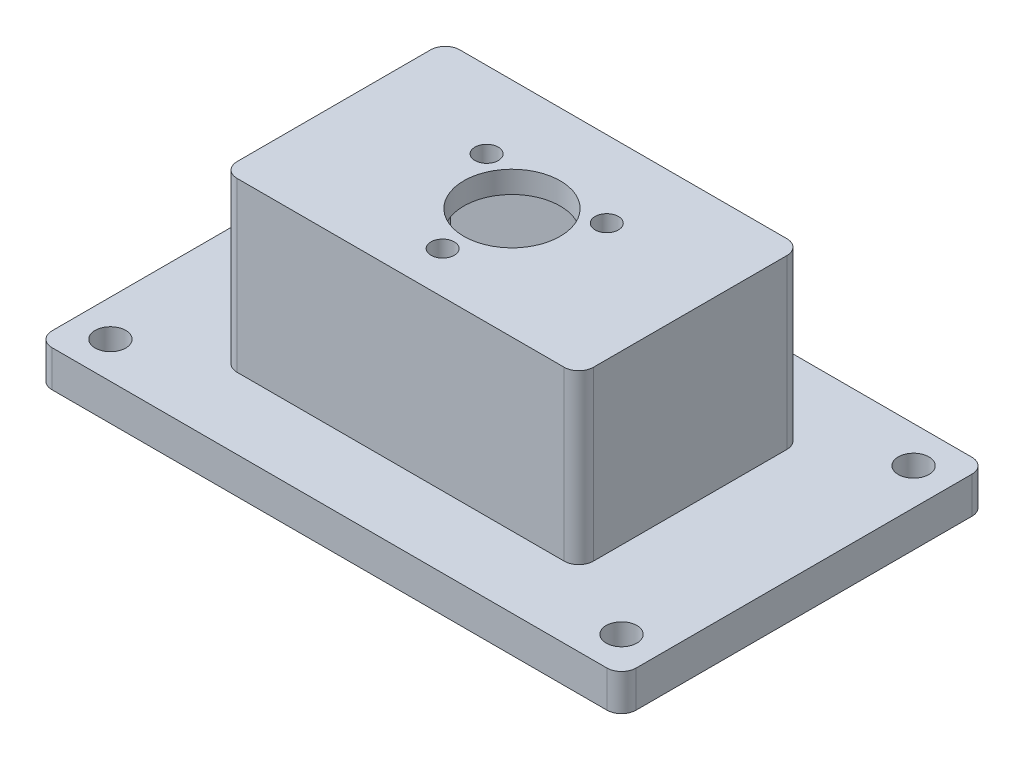
ISO-10303-21;
HEADER;
FILE_DESCRIPTION(('STEP AP214'),'2;1');
FILE_NAME('part.step','',(''),(''),'','','');
FILE_SCHEMA(('AUTOMOTIVE_DESIGN { 1 0 10303 214 1 1 1 1 }'));
ENDSEC;
DATA;
#1=APPLICATION_CONTEXT('core data for automotive mechanical design processes');
#2=APPLICATION_PROTOCOL_DEFINITION('international standard','automotive_design',2000,#1);
#3=PRODUCT_CONTEXT('',#1,'mechanical');
#4=PRODUCT('Part','Part','',(#3));
#5=PRODUCT_RELATED_PRODUCT_CATEGORY('part','',(#4));
#6=PRODUCT_DEFINITION_FORMATION('','',#4);
#7=PRODUCT_DEFINITION_CONTEXT('part definition',#1,'design');
#8=PRODUCT_DEFINITION('design','',#6,#7);
#9=PRODUCT_DEFINITION_SHAPE('','',#8);
#10=(LENGTH_UNIT() NAMED_UNIT(*) SI_UNIT(.MILLI.,.METRE.));
#11=(NAMED_UNIT(*) PLANE_ANGLE_UNIT() SI_UNIT($,.RADIAN.));
#12=(NAMED_UNIT(*) SI_UNIT($,.STERADIAN.) SOLID_ANGLE_UNIT());
#13=UNCERTAINTY_MEASURE_WITH_UNIT(LENGTH_MEASURE(1.E-05),#10,'distance_accuracy_value','');
#14=(GEOMETRIC_REPRESENTATION_CONTEXT(3) GLOBAL_UNCERTAINTY_ASSIGNED_CONTEXT((#13)) GLOBAL_UNIT_ASSIGNED_CONTEXT((#10,
#11,#12)) REPRESENTATION_CONTEXT('',''));
#15=CARTESIAN_POINT('',(0.,0.,0.));
#16=DIRECTION('',(0.,0.,1.));
#17=DIRECTION('',(1.,0.,0.));
#18=AXIS2_PLACEMENT_3D('',#15,#16,#17);
#19=CARTESIAN_POINT('',(0.,5.,0.));
#20=DIRECTION('',(0.,-1.,0.));
#21=DIRECTION('',(0.,0.,-1.));
#22=AXIS2_PLACEMENT_3D('',#19,#20,#21);
#23=PLANE('',#22);
#24=CARTESIAN_POINT('',(-35.,5.,-20.));
#25=DIRECTION('',(0.,1.,0.));
#26=DIRECTION('',(0.,0.,-1.));
#27=AXIS2_PLACEMENT_3D('',#24,#25,#26);
#28=CIRCLE('',#27,2.1);
#29=CARTESIAN_POINT('',(-35.,5.,-22.1));
#30=VERTEX_POINT('',#29);
#31=EDGE_CURVE('E224',#30,#30,#28,.T.);
#32=ORIENTED_EDGE('',*,*,#31,.F.);
#33=EDGE_LOOP('',(#32));
#34=FACE_BOUND('',#33,.T.);
#35=CARTESIAN_POINT('',(-35.,5.,20.));
#36=DIRECTION('',(0.,1.,0.));
#37=DIRECTION('',(0.,0.,1.));
#38=AXIS2_PLACEMENT_3D('',#35,#36,#37);
#39=CIRCLE('',#38,2.1);
#40=CARTESIAN_POINT('',(-35.,5.,22.1));
#41=VERTEX_POINT('',#40);
#42=EDGE_CURVE('E230',#41,#41,#39,.T.);
#43=ORIENTED_EDGE('',*,*,#42,.F.);
#44=EDGE_LOOP('',(#43));
#45=FACE_BOUND('',#44,.T.);
#46=CARTESIAN_POINT('',(35.,5.,20.));
#47=DIRECTION('',(0.,1.,0.));
#48=DIRECTION('',(0.,0.,-1.));
#49=AXIS2_PLACEMENT_3D('',#46,#47,#48);
#50=CIRCLE('',#49,2.1);
#51=CARTESIAN_POINT('',(35.,5.,17.9));
#52=VERTEX_POINT('',#51);
#53=EDGE_CURVE('E236',#52,#52,#50,.T.);
#54=ORIENTED_EDGE('',*,*,#53,.F.);
#55=EDGE_LOOP('',(#54));
#56=FACE_BOUND('',#55,.T.);
#57=DIRECTION('',(-1.,0.,0.));
#58=VECTOR('',#57,1.);
#59=CARTESIAN_POINT('',(-40.,5.,-25.));
#60=LINE('',#59,#58);
#61=CARTESIAN_POINT('',(38.,5.,-25.));
#62=VERTEX_POINT('',#61);
#63=CARTESIAN_POINT('',(-38.,5.,-25.));
#64=VERTEX_POINT('',#63);
#65=EDGE_CURVE('E264',#62,#64,#60,.T.);
#66=ORIENTED_EDGE('',*,*,#65,.T.);
#67=CARTESIAN_POINT('',(-38.,5.,-23.));
#68=DIRECTION('',(0.,-1.,0.));
#69=DIRECTION('',(0.,0.,-1.));
#70=AXIS2_PLACEMENT_3D('',#67,#68,#69);
#71=CIRCLE('',#70,2.);
#72=CARTESIAN_POINT('',(-40.,5.,-23.));
#73=VERTEX_POINT('',#72);
#74=EDGE_CURVE('E308',#64,#73,#71,.F.);
#75=ORIENTED_EDGE('',*,*,#74,.T.);
#76=DIRECTION('',(0.,0.,1.));
#77=VECTOR('',#76,1.);
#78=CARTESIAN_POINT('',(-40.,5.,25.));
#79=LINE('',#78,#77);
#80=CARTESIAN_POINT('',(-40.,5.,23.));
#81=VERTEX_POINT('',#80);
#82=EDGE_CURVE('E268',#73,#81,#79,.T.);
#83=ORIENTED_EDGE('',*,*,#82,.T.);
#84=CARTESIAN_POINT('',(-38.,5.,23.));
#85=DIRECTION('',(0.,-1.,0.));
#86=DIRECTION('',(0.,0.,-1.));
#87=AXIS2_PLACEMENT_3D('',#84,#85,#86);
#88=CIRCLE('',#87,2.);
#89=CARTESIAN_POINT('',(-38.,5.,25.));
#90=VERTEX_POINT('',#89);
#91=EDGE_CURVE('E306',#81,#90,#88,.F.);
#92=ORIENTED_EDGE('',*,*,#91,.T.);
#93=DIRECTION('',(1.,0.,0.));
#94=VECTOR('',#93,1.);
#95=CARTESIAN_POINT('',(-40.,5.,25.));
#96=LINE('',#95,#94);
#97=CARTESIAN_POINT('',(38.,5.,25.));
#98=VERTEX_POINT('',#97);
#99=EDGE_CURVE('E271',#90,#98,#96,.T.);
#100=ORIENTED_EDGE('',*,*,#99,.T.);
#101=CARTESIAN_POINT('',(38.,5.,23.));
#102=DIRECTION('',(0.,-1.,0.));
#103=DIRECTION('',(0.,0.,-1.));
#104=AXIS2_PLACEMENT_3D('',#101,#102,#103);
#105=CIRCLE('',#104,2.);
#106=CARTESIAN_POINT('',(40.,5.,23.));
#107=VERTEX_POINT('',#106);
#108=EDGE_CURVE('E304',#98,#107,#105,.F.);
#109=ORIENTED_EDGE('',*,*,#108,.T.);
#110=DIRECTION('',(0.,0.,-1.));
#111=VECTOR('',#110,1.);
#112=CARTESIAN_POINT('',(40.,5.,25.));
#113=LINE('',#112,#111);
#114=CARTESIAN_POINT('',(40.,5.,-23.));
#115=VERTEX_POINT('',#114);
#116=EDGE_CURVE('E261',#107,#115,#113,.T.);
#117=ORIENTED_EDGE('',*,*,#116,.T.);
#118=CARTESIAN_POINT('',(38.,5.,-23.));
#119=DIRECTION('',(0.,-1.,0.));
#120=DIRECTION('',(0.,0.,-1.));
#121=AXIS2_PLACEMENT_3D('',#118,#119,#120);
#122=CIRCLE('',#121,2.);
#123=EDGE_CURVE('E302',#115,#62,#122,.F.);
#124=ORIENTED_EDGE('',*,*,#123,.T.);
#125=EDGE_LOOP('',(#66,#75,#83,#92,#100,#109,#117,#124));
#126=FACE_BOUND('',#125,.T.);
#127=CARTESIAN_POINT('',(35.,5.,-20.));
#128=DIRECTION('',(0.,1.,0.));
#129=DIRECTION('',(0.,0.,1.));
#130=AXIS2_PLACEMENT_3D('',#127,#128,#129);
#131=CIRCLE('',#130,2.1);
#132=CARTESIAN_POINT('',(35.,5.,-17.9));
#133=VERTEX_POINT('',#132);
#134=EDGE_CURVE('E255',#133,#133,#131,.T.);
#135=ORIENTED_EDGE('',*,*,#134,.F.);
#136=EDGE_LOOP('',(#135));
#137=FACE_BOUND('',#136,.T.);
#138=DIRECTION('',(0.,0.,-1.));
#139=VECTOR('',#138,1.);
#140=CARTESIAN_POINT('',(24.4,5.,15.25));
#141=LINE('',#140,#139);
#142=CARTESIAN_POINT('',(24.4,5.,13.25));
#143=VERTEX_POINT('',#142);
#144=CARTESIAN_POINT('',(24.4,5.,-13.25));
#145=VERTEX_POINT('',#144);
#146=EDGE_CURVE('E212',#143,#145,#141,.T.);
#147=ORIENTED_EDGE('',*,*,#146,.F.);
#148=CARTESIAN_POINT('',(22.4,5.,13.25));
#149=DIRECTION('',(0.,-1.,0.));
#150=DIRECTION('',(0.,0.,-1.));
#151=AXIS2_PLACEMENT_3D('',#148,#149,#150);
#152=CIRCLE('',#151,2.);
#153=CARTESIAN_POINT('',(22.4,5.,15.25));
#154=VERTEX_POINT('',#153);
#155=EDGE_CURVE('E11',#143,#154,#152,.T.);
#156=ORIENTED_EDGE('',*,*,#155,.T.);
#157=DIRECTION('',(1.,0.,0.));
#158=VECTOR('',#157,1.);
#159=CARTESIAN_POINT('',(-24.4,5.,15.25));
#160=LINE('',#159,#158);
#161=CARTESIAN_POINT('',(-22.4,5.,15.25));
#162=VERTEX_POINT('',#161);
#163=EDGE_CURVE('E220',#162,#154,#160,.T.);
#164=ORIENTED_EDGE('',*,*,#163,.F.);
#165=CARTESIAN_POINT('',(-22.4,5.,13.25));
#166=DIRECTION('',(0.,-1.,0.));
#167=DIRECTION('',(0.,0.,-1.));
#168=AXIS2_PLACEMENT_3D('',#165,#166,#167);
#169=CIRCLE('',#168,2.);
#170=CARTESIAN_POINT('',(-24.4,5.,13.25));
#171=VERTEX_POINT('',#170);
#172=EDGE_CURVE('E349',#162,#171,#169,.T.);
#173=ORIENTED_EDGE('',*,*,#172,.T.);
#174=DIRECTION('',(0.,0.,1.));
#175=VECTOR('',#174,1.);
#176=CARTESIAN_POINT('',(-24.4,5.,15.25));
#177=LINE('',#176,#175);
#178=CARTESIAN_POINT('',(-24.4,5.,-13.25));
#179=VERTEX_POINT('',#178);
#180=EDGE_CURVE('E217',#179,#171,#177,.T.);
#181=ORIENTED_EDGE('',*,*,#180,.F.);
#182=CARTESIAN_POINT('',(-22.4,5.,-13.25));
#183=DIRECTION('',(0.,-1.,0.));
#184=DIRECTION('',(0.,0.,-1.));
#185=AXIS2_PLACEMENT_3D('',#182,#183,#184);
#186=CIRCLE('',#185,2.);
#187=CARTESIAN_POINT('',(-22.4,5.,-15.25));
#188=VERTEX_POINT('',#187);
#189=EDGE_CURVE('E347',#179,#188,#186,.T.);
#190=ORIENTED_EDGE('',*,*,#189,.T.);
#191=DIRECTION('',(-1.,0.,0.));
#192=VECTOR('',#191,1.);
#193=CARTESIAN_POINT('',(-24.4,5.,-15.25));
#194=LINE('',#193,#192);
#195=CARTESIAN_POINT('',(22.4,5.,-15.25));
#196=VERTEX_POINT('',#195);
#197=EDGE_CURVE('E214',#196,#188,#194,.T.);
#198=ORIENTED_EDGE('',*,*,#197,.F.);
#199=CARTESIAN_POINT('',(22.4,5.,-13.25));
#200=DIRECTION('',(0.,-1.,0.));
#201=DIRECTION('',(0.,0.,-1.));
#202=AXIS2_PLACEMENT_3D('',#199,#200,#201);
#203=CIRCLE('',#202,2.);
#204=EDGE_CURVE('E48',#196,#145,#203,.T.);
#205=ORIENTED_EDGE('',*,*,#204,.T.);
#206=EDGE_LOOP('',(#147,#156,#164,#173,#181,#190,#198,#205));
#207=FACE_BOUND('',#206,.T.);
#208=ADVANCED_FACE('F39',(#34,#45,#56,#126,#137,#207),#23,.F.);
#209=CARTESIAN_POINT('',(0.,0.,0.));
#210=DIRECTION('',(0.,-1.,0.));
#211=DIRECTION('',(0.,0.,-1.));
#212=AXIS2_PLACEMENT_3D('',#209,#210,#211);
#213=PLANE('',#212);
#214=CARTESIAN_POINT('',(-35.,0.,20.));
#215=DIRECTION('',(0.,1.,0.));
#216=DIRECTION('',(0.,0.,1.));
#217=AXIS2_PLACEMENT_3D('',#214,#215,#216);
#218=CIRCLE('',#217,2.1);
#219=CARTESIAN_POINT('',(-35.,0.,22.1));
#220=VERTEX_POINT('',#219);
#221=EDGE_CURVE('E227',#220,#220,#218,.T.);
#222=ORIENTED_EDGE('',*,*,#221,.T.);
#223=EDGE_LOOP('',(#222));
#224=FACE_BOUND('',#223,.T.);
#225=DIRECTION('',(1.,0.,0.));
#226=VECTOR('',#225,1.);
#227=CARTESIAN_POINT('',(-22.4,0.,14.));
#228=LINE('',#227,#226);
#229=CARTESIAN_POINT('',(-22.4,0.,14.));
#230=VERTEX_POINT('',#229);
#231=CARTESIAN_POINT('',(22.4,0.,14.));
#232=VERTEX_POINT('',#231);
#233=EDGE_CURVE('E198',#230,#232,#228,.T.);
#234=ORIENTED_EDGE('',*,*,#233,.T.);
#235=DIRECTION('',(0.,0.,-1.));
#236=VECTOR('',#235,1.);
#237=CARTESIAN_POINT('',(22.4,0.,14.));
#238=LINE('',#237,#236);
#239=CARTESIAN_POINT('',(22.4,0.,-14.));
#240=VERTEX_POINT('',#239);
#241=EDGE_CURVE('E193',#232,#240,#238,.T.);
#242=ORIENTED_EDGE('',*,*,#241,.T.);
#243=DIRECTION('',(-1.,0.,0.));
#244=VECTOR('',#243,1.);
#245=CARTESIAN_POINT('',(-22.4,0.,-14.));
#246=LINE('',#245,#244);
#247=CARTESIAN_POINT('',(-22.4,0.,-14.));
#248=VERTEX_POINT('',#247);
#249=EDGE_CURVE('E242',#240,#248,#246,.T.);
#250=ORIENTED_EDGE('',*,*,#249,.T.);
#251=DIRECTION('',(0.,0.,1.));
#252=VECTOR('',#251,1.);
#253=CARTESIAN_POINT('',(-22.4,0.,14.));
#254=LINE('',#253,#252);
#255=EDGE_CURVE('E245',#248,#230,#254,.T.);
#256=ORIENTED_EDGE('',*,*,#255,.T.);
#257=EDGE_LOOP('',(#234,#242,#250,#256));
#258=FACE_BOUND('',#257,.T.);
#259=CARTESIAN_POINT('',(35.,0.,-20.));
#260=DIRECTION('',(0.,1.,0.));
#261=DIRECTION('',(0.,0.,1.));
#262=AXIS2_PLACEMENT_3D('',#259,#260,#261);
#263=CIRCLE('',#262,2.1);
#264=CARTESIAN_POINT('',(35.,0.,-17.9));
#265=VERTEX_POINT('',#264);
#266=EDGE_CURVE('E254',#265,#265,#263,.T.);
#267=ORIENTED_EDGE('',*,*,#266,.T.);
#268=EDGE_LOOP('',(#267));
#269=FACE_BOUND('',#268,.T.);
#270=DIRECTION('',(0.,0.,1.));
#271=VECTOR('',#270,1.);
#272=CARTESIAN_POINT('',(-40.,0.,25.));
#273=LINE('',#272,#271);
#274=CARTESIAN_POINT('',(-40.,0.,-23.));
#275=VERTEX_POINT('',#274);
#276=CARTESIAN_POINT('',(-40.,0.,23.));
#277=VERTEX_POINT('',#276);
#278=EDGE_CURVE('E280',#275,#277,#273,.T.);
#279=ORIENTED_EDGE('',*,*,#278,.F.);
#280=CARTESIAN_POINT('',(-38.,0.,-23.));
#281=DIRECTION('',(0.,-1.,0.));
#282=DIRECTION('',(0.,0.,-1.));
#283=AXIS2_PLACEMENT_3D('',#280,#281,#282);
#284=CIRCLE('',#283,2.);
#285=CARTESIAN_POINT('',(-38.,0.,-25.));
#286=VERTEX_POINT('',#285);
#287=EDGE_CURVE('E295',#275,#286,#284,.T.);
#288=ORIENTED_EDGE('',*,*,#287,.T.);
#289=DIRECTION('',(-1.,0.,0.));
#290=VECTOR('',#289,1.);
#291=CARTESIAN_POINT('',(-40.,0.,-25.));
#292=LINE('',#291,#290);
#293=CARTESIAN_POINT('',(38.,0.,-25.));
#294=VERTEX_POINT('',#293);
#295=EDGE_CURVE('E277',#294,#286,#292,.T.);
#296=ORIENTED_EDGE('',*,*,#295,.F.);
#297=CARTESIAN_POINT('',(38.,0.,-23.));
#298=DIRECTION('',(0.,-1.,0.));
#299=DIRECTION('',(0.,0.,-1.));
#300=AXIS2_PLACEMENT_3D('',#297,#298,#299);
#301=CIRCLE('',#300,2.);
#302=CARTESIAN_POINT('',(40.,0.,-23.));
#303=VERTEX_POINT('',#302);
#304=EDGE_CURVE('E289',#294,#303,#301,.T.);
#305=ORIENTED_EDGE('',*,*,#304,.T.);
#306=DIRECTION('',(0.,0.,-1.));
#307=VECTOR('',#306,1.);
#308=CARTESIAN_POINT('',(40.,0.,25.));
#309=LINE('',#308,#307);
#310=CARTESIAN_POINT('',(40.,0.,23.));
#311=VERTEX_POINT('',#310);
#312=EDGE_CURVE('E258',#311,#303,#309,.T.);
#313=ORIENTED_EDGE('',*,*,#312,.F.);
#314=CARTESIAN_POINT('',(38.,0.,23.));
#315=DIRECTION('',(0.,-1.,0.));
#316=DIRECTION('',(0.,0.,-1.));
#317=AXIS2_PLACEMENT_3D('',#314,#315,#316);
#318=CIRCLE('',#317,2.);
#319=CARTESIAN_POINT('',(38.,0.,25.));
#320=VERTEX_POINT('',#319);
#321=EDGE_CURVE('E291',#311,#320,#318,.T.);
#322=ORIENTED_EDGE('',*,*,#321,.T.);
#323=DIRECTION('',(1.,0.,0.));
#324=VECTOR('',#323,1.);
#325=CARTESIAN_POINT('',(-40.,0.,25.));
#326=LINE('',#325,#324);
#327=CARTESIAN_POINT('',(-38.,0.,25.));
#328=VERTEX_POINT('',#327);
#329=EDGE_CURVE('E265',#328,#320,#326,.T.);
#330=ORIENTED_EDGE('',*,*,#329,.F.);
#331=CARTESIAN_POINT('',(-38.,0.,23.));
#332=DIRECTION('',(0.,-1.,0.));
#333=DIRECTION('',(0.,0.,-1.));
#334=AXIS2_PLACEMENT_3D('',#331,#332,#333);
#335=CIRCLE('',#334,2.);
#336=EDGE_CURVE('E293',#328,#277,#335,.T.);
#337=ORIENTED_EDGE('',*,*,#336,.T.);
#338=EDGE_LOOP('',(#279,#288,#296,#305,#313,#322,#330,#337));
#339=FACE_BOUND('',#338,.T.);
#340=CARTESIAN_POINT('',(35.,0.,20.));
#341=DIRECTION('',(0.,1.,0.));
#342=DIRECTION('',(0.,0.,-1.));
#343=AXIS2_PLACEMENT_3D('',#340,#341,#342);
#344=CIRCLE('',#343,2.1);
#345=CARTESIAN_POINT('',(35.,0.,17.9));
#346=VERTEX_POINT('',#345);
#347=EDGE_CURVE('E233',#346,#346,#344,.T.);
#348=ORIENTED_EDGE('',*,*,#347,.T.);
#349=EDGE_LOOP('',(#348));
#350=FACE_BOUND('',#349,.T.);
#351=CARTESIAN_POINT('',(-35.,0.,-20.));
#352=DIRECTION('',(0.,1.,0.));
#353=DIRECTION('',(0.,0.,-1.));
#354=AXIS2_PLACEMENT_3D('',#351,#352,#353);
#355=CIRCLE('',#354,2.1);
#356=CARTESIAN_POINT('',(-35.,0.,-22.1));
#357=VERTEX_POINT('',#356);
#358=EDGE_CURVE('E223',#357,#357,#355,.T.);
#359=ORIENTED_EDGE('',*,*,#358,.T.);
#360=EDGE_LOOP('',(#359));
#361=FACE_BOUND('',#360,.T.);
#362=ADVANCED_FACE('F420',(#224,#258,#269,#339,#350,#361),#213,.T.);
#363=CARTESIAN_POINT('',(40.,5.,25.));
#364=DIRECTION('',(-1.,0.,0.));
#365=DIRECTION('',(0.,0.,1.));
#366=AXIS2_PLACEMENT_3D('',#363,#364,#365);
#367=PLANE('',#366);
#368=ORIENTED_EDGE('',*,*,#116,.F.);
#369=DIRECTION('',(0.,-1.,0.));
#370=VECTOR('',#369,1.);
#371=CARTESIAN_POINT('',(40.,5.,23.));
#372=LINE('',#371,#370);
#373=EDGE_CURVE('E317',#107,#311,#372,.T.);
#374=ORIENTED_EDGE('',*,*,#373,.T.);
#375=ORIENTED_EDGE('',*,*,#312,.T.);
#376=DIRECTION('',(0.,-1.,0.));
#377=VECTOR('',#376,1.);
#378=CARTESIAN_POINT('',(40.,5.,-23.));
#379=LINE('',#378,#377);
#380=EDGE_CURVE('E315',#303,#115,#379,.F.);
#381=ORIENTED_EDGE('',*,*,#380,.T.);
#382=EDGE_LOOP('',(#368,#374,#375,#381));
#383=FACE_BOUND('',#382,.T.);
#384=ADVANCED_FACE('F426',(#383),#367,.F.);
#385=CARTESIAN_POINT('',(-40.,5.,-25.));
#386=DIRECTION('',(0.,0.,1.));
#387=DIRECTION('',(1.,0.,0.));
#388=AXIS2_PLACEMENT_3D('',#385,#386,#387);
#389=PLANE('',#388);
#390=ORIENTED_EDGE('',*,*,#295,.T.);
#391=DIRECTION('',(0.,-1.,0.));
#392=VECTOR('',#391,1.);
#393=CARTESIAN_POINT('',(-38.,5.,-25.));
#394=LINE('',#393,#392);
#395=EDGE_CURVE('E300',#286,#64,#394,.F.);
#396=ORIENTED_EDGE('',*,*,#395,.T.);
#397=ORIENTED_EDGE('',*,*,#65,.F.);
#398=DIRECTION('',(0.,-1.,0.));
#399=VECTOR('',#398,1.);
#400=CARTESIAN_POINT('',(38.,5.,-25.));
#401=LINE('',#400,#399);
#402=EDGE_CURVE('E297',#62,#294,#401,.T.);
#403=ORIENTED_EDGE('',*,*,#402,.T.);
#404=EDGE_LOOP('',(#390,#396,#397,#403));
#405=FACE_BOUND('',#404,.T.);
#406=ADVANCED_FACE('F442',(#405),#389,.F.);
#407=CARTESIAN_POINT('',(-40.,5.,25.));
#408=DIRECTION('',(1.,0.,0.));
#409=DIRECTION('',(0.,0.,-1.));
#410=AXIS2_PLACEMENT_3D('',#407,#408,#409);
#411=PLANE('',#410);
#412=ORIENTED_EDGE('',*,*,#82,.F.);
#413=DIRECTION('',(0.,-1.,0.));
#414=VECTOR('',#413,1.);
#415=CARTESIAN_POINT('',(-40.,5.,-23.));
#416=LINE('',#415,#414);
#417=EDGE_CURVE('E286',#73,#275,#416,.T.);
#418=ORIENTED_EDGE('',*,*,#417,.T.);
#419=ORIENTED_EDGE('',*,*,#278,.T.);
#420=DIRECTION('',(0.,-1.,0.));
#421=VECTOR('',#420,1.);
#422=CARTESIAN_POINT('',(-40.,5.,23.));
#423=LINE('',#422,#421);
#424=EDGE_CURVE('E274',#277,#81,#423,.F.);
#425=ORIENTED_EDGE('',*,*,#424,.T.);
#426=EDGE_LOOP('',(#412,#418,#419,#425));
#427=FACE_BOUND('',#426,.T.);
#428=ADVANCED_FACE('F438',(#427),#411,.F.);
#429=CARTESIAN_POINT('',(-40.,5.,25.));
#430=DIRECTION('',(0.,0.,-1.));
#431=DIRECTION('',(-1.,0.,0.));
#432=AXIS2_PLACEMENT_3D('',#429,#430,#431);
#433=PLANE('',#432);
#434=ORIENTED_EDGE('',*,*,#99,.F.);
#435=DIRECTION('',(0.,-1.,0.));
#436=VECTOR('',#435,1.);
#437=CARTESIAN_POINT('',(-38.,5.,25.));
#438=LINE('',#437,#436);
#439=EDGE_CURVE('E312',#90,#328,#438,.T.);
#440=ORIENTED_EDGE('',*,*,#439,.T.);
#441=ORIENTED_EDGE('',*,*,#329,.T.);
#442=DIRECTION('',(0.,-1.,0.));
#443=VECTOR('',#442,1.);
#444=CARTESIAN_POINT('',(38.,5.,25.));
#445=LINE('',#444,#443);
#446=EDGE_CURVE('E310',#320,#98,#445,.F.);
#447=ORIENTED_EDGE('',*,*,#446,.T.);
#448=EDGE_LOOP('',(#434,#440,#441,#447));
#449=FACE_BOUND('',#448,.T.);
#450=ADVANCED_FACE('F435',(#449),#433,.F.);
#451=CARTESIAN_POINT('',(35.,5.,-20.));
#452=DIRECTION('',(0.,-1.,0.));
#453=DIRECTION('',(0.,0.,-1.));
#454=AXIS2_PLACEMENT_3D('',#451,#452,#453);
#455=CYLINDRICAL_SURFACE('',#454,2.1);
#456=ORIENTED_EDGE('',*,*,#134,.T.);
#457=EDGE_LOOP('',(#456));
#458=FACE_BOUND('',#457,.T.);
#459=ORIENTED_EDGE('',*,*,#266,.F.);
#460=EDGE_LOOP('',(#459));
#461=FACE_BOUND('',#460,.T.);
#462=ADVANCED_FACE('F432',(#458,#461),#455,.F.);
#463=CARTESIAN_POINT('',(22.4,5.,14.));
#464=DIRECTION('',(-1.,0.,0.));
#465=DIRECTION('',(0.,0.,1.));
#466=AXIS2_PLACEMENT_3D('',#463,#464,#465);
#467=PLANE('',#466);
#468=ORIENTED_EDGE('',*,*,#241,.F.);
#469=DIRECTION('',(0.,-1.,0.));
#470=VECTOR('',#469,1.);
#471=CARTESIAN_POINT('',(22.4,5.,14.));
#472=LINE('',#471,#470);
#473=CARTESIAN_POINT('',(22.4,25.,14.));
#474=VERTEX_POINT('',#473);
#475=EDGE_CURVE('E190',#474,#232,#472,.T.);
#476=ORIENTED_EDGE('',*,*,#475,.F.);
#477=DIRECTION('',(0.,0.,-1.));
#478=VECTOR('',#477,1.);
#479=CARTESIAN_POINT('',(22.4,25.,14.));
#480=LINE('',#479,#478);
#481=CARTESIAN_POINT('',(22.4,25.,-14.));
#482=VERTEX_POINT('',#481);
#483=EDGE_CURVE('E176',#474,#482,#480,.T.);
#484=ORIENTED_EDGE('',*,*,#483,.T.);
#485=DIRECTION('',(0.,-1.,0.));
#486=VECTOR('',#485,1.);
#487=CARTESIAN_POINT('',(22.4,5.,-14.));
#488=LINE('',#487,#486);
#489=EDGE_CURVE('E252',#482,#240,#488,.T.);
#490=ORIENTED_EDGE('',*,*,#489,.T.);
#491=EDGE_LOOP('',(#468,#476,#484,#490));
#492=FACE_BOUND('',#491,.T.);
#493=ADVANCED_FACE('F191',(#492),#467,.T.);
#494=CARTESIAN_POINT('',(-22.4,5.,-14.));
#495=DIRECTION('',(0.,0.,1.));
#496=DIRECTION('',(1.,0.,0.));
#497=AXIS2_PLACEMENT_3D('',#494,#495,#496);
#498=PLANE('',#497);
#499=ORIENTED_EDGE('',*,*,#249,.F.);
#500=ORIENTED_EDGE('',*,*,#489,.F.);
#501=DIRECTION('',(-1.,0.,0.));
#502=VECTOR('',#501,1.);
#503=CARTESIAN_POINT('',(22.4,25.,-14.));
#504=LINE('',#503,#502);
#505=CARTESIAN_POINT('',(-22.4,25.,-14.));
#506=VERTEX_POINT('',#505);
#507=EDGE_CURVE('E184',#482,#506,#504,.T.);
#508=ORIENTED_EDGE('',*,*,#507,.T.);
#509=DIRECTION('',(0.,-1.,0.));
#510=VECTOR('',#509,1.);
#511=CARTESIAN_POINT('',(-22.4,5.,-14.));
#512=LINE('',#511,#510);
#513=EDGE_CURVE('E250',#506,#248,#512,.T.);
#514=ORIENTED_EDGE('',*,*,#513,.T.);
#515=EDGE_LOOP('',(#499,#500,#508,#514));
#516=FACE_BOUND('',#515,.T.);
#517=ADVANCED_FACE('F621',(#516),#498,.T.);
#518=CARTESIAN_POINT('',(-22.4,5.,14.));
#519=DIRECTION('',(1.,0.,0.));
#520=DIRECTION('',(0.,0.,-1.));
#521=AXIS2_PLACEMENT_3D('',#518,#519,#520);
#522=PLANE('',#521);
#523=ORIENTED_EDGE('',*,*,#255,.F.);
#524=ORIENTED_EDGE('',*,*,#513,.F.);
#525=DIRECTION('',(0.,0.,1.));
#526=VECTOR('',#525,1.);
#527=CARTESIAN_POINT('',(-22.4,25.,-14.));
#528=LINE('',#527,#526);
#529=CARTESIAN_POINT('',(-22.4,25.,14.));
#530=VERTEX_POINT('',#529);
#531=EDGE_CURVE('E210',#506,#530,#528,.T.);
#532=ORIENTED_EDGE('',*,*,#531,.T.);
#533=DIRECTION('',(0.,-1.,0.));
#534=VECTOR('',#533,1.);
#535=CARTESIAN_POINT('',(-22.4,5.,14.));
#536=LINE('',#535,#534);
#537=EDGE_CURVE('E197',#530,#230,#536,.T.);
#538=ORIENTED_EDGE('',*,*,#537,.T.);
#539=EDGE_LOOP('',(#523,#524,#532,#538));
#540=FACE_BOUND('',#539,.T.);
#541=ADVANCED_FACE('F632',(#540),#522,.T.);
#542=CARTESIAN_POINT('',(-22.4,5.,14.));
#543=DIRECTION('',(0.,0.,-1.));
#544=DIRECTION('',(-1.,0.,0.));
#545=AXIS2_PLACEMENT_3D('',#542,#543,#544);
#546=PLANE('',#545);
#547=ORIENTED_EDGE('',*,*,#233,.F.);
#548=ORIENTED_EDGE('',*,*,#537,.F.);
#549=DIRECTION('',(1.,0.,0.));
#550=VECTOR('',#549,1.);
#551=CARTESIAN_POINT('',(-22.4,25.,14.));
#552=LINE('',#551,#550);
#553=EDGE_CURVE('E181',#530,#474,#552,.T.);
#554=ORIENTED_EDGE('',*,*,#553,.T.);
#555=ORIENTED_EDGE('',*,*,#475,.T.);
#556=EDGE_LOOP('',(#547,#548,#554,#555));
#557=FACE_BOUND('',#556,.T.);
#558=ADVANCED_FACE('F200',(#557),#546,.T.);
#559=CARTESIAN_POINT('',(35.,5.,20.));
#560=DIRECTION('',(0.,-1.,0.));
#561=DIRECTION('',(0.,0.,-1.));
#562=AXIS2_PLACEMENT_3D('',#559,#560,#561);
#563=CYLINDRICAL_SURFACE('',#562,2.1);
#564=ORIENTED_EDGE('',*,*,#53,.T.);
#565=EDGE_LOOP('',(#564));
#566=FACE_BOUND('',#565,.T.);
#567=ORIENTED_EDGE('',*,*,#347,.F.);
#568=EDGE_LOOP('',(#567));
#569=FACE_BOUND('',#568,.T.);
#570=ADVANCED_FACE('F652',(#566,#569),#563,.F.);
#571=CARTESIAN_POINT('',(-35.,5.,20.));
#572=DIRECTION('',(0.,-1.,0.));
#573=DIRECTION('',(0.,0.,-1.));
#574=AXIS2_PLACEMENT_3D('',#571,#572,#573);
#575=CYLINDRICAL_SURFACE('',#574,2.1);
#576=ORIENTED_EDGE('',*,*,#42,.T.);
#577=EDGE_LOOP('',(#576));
#578=FACE_BOUND('',#577,.T.);
#579=ORIENTED_EDGE('',*,*,#221,.F.);
#580=EDGE_LOOP('',(#579));
#581=FACE_BOUND('',#580,.T.);
#582=ADVANCED_FACE('F664',(#578,#581),#575,.F.);
#583=CARTESIAN_POINT('',(-35.,5.,-20.));
#584=DIRECTION('',(0.,-1.,0.));
#585=DIRECTION('',(0.,0.,-1.));
#586=AXIS2_PLACEMENT_3D('',#583,#584,#585);
#587=CYLINDRICAL_SURFACE('',#586,2.1);
#588=ORIENTED_EDGE('',*,*,#31,.T.);
#589=EDGE_LOOP('',(#588));
#590=FACE_BOUND('',#589,.T.);
#591=ORIENTED_EDGE('',*,*,#358,.F.);
#592=EDGE_LOOP('',(#591));
#593=FACE_BOUND('',#592,.T.);
#594=ADVANCED_FACE('F454',(#590,#593),#587,.F.);
#595=CARTESIAN_POINT('',(-38.,5.,-23.));
#596=DIRECTION('',(0.,-1.,0.));
#597=DIRECTION('',(0.,0.,-1.));
#598=AXIS2_PLACEMENT_3D('',#595,#596,#597);
#599=CYLINDRICAL_SURFACE('',#598,2.);
#600=ORIENTED_EDGE('',*,*,#74,.F.);
#601=ORIENTED_EDGE('',*,*,#395,.F.);
#602=ORIENTED_EDGE('',*,*,#287,.F.);
#603=ORIENTED_EDGE('',*,*,#417,.F.);
#604=EDGE_LOOP('',(#600,#601,#602,#603));
#605=FACE_BOUND('',#604,.T.);
#606=ADVANCED_FACE('F450',(#605),#599,.T.);
#607=CARTESIAN_POINT('',(-38.,5.,23.));
#608=DIRECTION('',(0.,-1.,0.));
#609=DIRECTION('',(0.,0.,-1.));
#610=AXIS2_PLACEMENT_3D('',#607,#608,#609);
#611=CYLINDRICAL_SURFACE('',#610,2.);
#612=ORIENTED_EDGE('',*,*,#91,.F.);
#613=ORIENTED_EDGE('',*,*,#424,.F.);
#614=ORIENTED_EDGE('',*,*,#336,.F.);
#615=ORIENTED_EDGE('',*,*,#439,.F.);
#616=EDGE_LOOP('',(#612,#613,#614,#615));
#617=FACE_BOUND('',#616,.T.);
#618=ADVANCED_FACE('F453',(#617),#611,.T.);
#619=CARTESIAN_POINT('',(38.,5.,23.));
#620=DIRECTION('',(0.,-1.,0.));
#621=DIRECTION('',(0.,0.,-1.));
#622=AXIS2_PLACEMENT_3D('',#619,#620,#621);
#623=CYLINDRICAL_SURFACE('',#622,2.);
#624=ORIENTED_EDGE('',*,*,#108,.F.);
#625=ORIENTED_EDGE('',*,*,#446,.F.);
#626=ORIENTED_EDGE('',*,*,#321,.F.);
#627=ORIENTED_EDGE('',*,*,#373,.F.);
#628=EDGE_LOOP('',(#624,#625,#626,#627));
#629=FACE_BOUND('',#628,.T.);
#630=ADVANCED_FACE('F458',(#629),#623,.T.);
#631=CARTESIAN_POINT('',(38.,5.,-23.));
#632=DIRECTION('',(0.,-1.,0.));
#633=DIRECTION('',(0.,0.,-1.));
#634=AXIS2_PLACEMENT_3D('',#631,#632,#633);
#635=CYLINDRICAL_SURFACE('',#634,2.);
#636=ORIENTED_EDGE('',*,*,#123,.F.);
#637=ORIENTED_EDGE('',*,*,#380,.F.);
#638=ORIENTED_EDGE('',*,*,#304,.F.);
#639=ORIENTED_EDGE('',*,*,#402,.F.);
#640=EDGE_LOOP('',(#636,#637,#638,#639));
#641=FACE_BOUND('',#640,.T.);
#642=ADVANCED_FACE('F417',(#641),#635,.T.);
#643=CARTESIAN_POINT('',(24.4,25.,15.25));
#644=DIRECTION('',(-1.,0.,0.));
#645=DIRECTION('',(0.,0.,1.));
#646=AXIS2_PLACEMENT_3D('',#643,#644,#645);
#647=PLANE('',#646);
#648=ORIENTED_EDGE('',*,*,#146,.T.);
#649=DIRECTION('',(0.,-1.,0.));
#650=VECTOR('',#649,1.);
#651=CARTESIAN_POINT('',(24.4,25.,-13.25));
#652=LINE('',#651,#650);
#653=CARTESIAN_POINT('',(24.4,28.,-13.25));
#654=VERTEX_POINT('',#653);
#655=EDGE_CURVE('E345',#145,#654,#652,.F.);
#656=ORIENTED_EDGE('',*,*,#655,.T.);
#657=DIRECTION('',(0.,0.,-1.));
#658=VECTOR('',#657,1.);
#659=CARTESIAN_POINT('',(24.4,28.,15.25));
#660=LINE('',#659,#658);
#661=CARTESIAN_POINT('',(24.4,28.,13.25));
#662=VERTEX_POINT('',#661);
#663=EDGE_CURVE('E374',#662,#654,#660,.T.);
#664=ORIENTED_EDGE('',*,*,#663,.F.);
#665=DIRECTION('',(0.,-1.,0.));
#666=VECTOR('',#665,1.);
#667=CARTESIAN_POINT('',(24.4,25.,13.25));
#668=LINE('',#667,#666);
#669=EDGE_CURVE('E343',#662,#143,#668,.T.);
#670=ORIENTED_EDGE('',*,*,#669,.T.);
#671=EDGE_LOOP('',(#648,#656,#664,#670));
#672=FACE_BOUND('',#671,.T.);
#673=ADVANCED_FACE('F405',(#672),#647,.F.);
#674=CARTESIAN_POINT('',(-24.4,25.,-15.25));
#675=DIRECTION('',(0.,0.,1.));
#676=DIRECTION('',(1.,0.,0.));
#677=AXIS2_PLACEMENT_3D('',#674,#675,#676);
#678=PLANE('',#677);
#679=ORIENTED_EDGE('',*,*,#197,.T.);
#680=DIRECTION('',(0.,-1.,0.));
#681=VECTOR('',#680,1.);
#682=CARTESIAN_POINT('',(-22.4,25.,-15.25));
#683=LINE('',#682,#681);
#684=CARTESIAN_POINT('',(-22.4,28.,-15.25));
#685=VERTEX_POINT('',#684);
#686=EDGE_CURVE('E328',#188,#685,#683,.F.);
#687=ORIENTED_EDGE('',*,*,#686,.T.);
#688=DIRECTION('',(-1.,0.,0.));
#689=VECTOR('',#688,1.);
#690=CARTESIAN_POINT('',(24.4,28.,-15.25));
#691=LINE('',#690,#689);
#692=CARTESIAN_POINT('',(22.4,28.,-15.25));
#693=VERTEX_POINT('',#692);
#694=EDGE_CURVE('E205',#693,#685,#691,.T.);
#695=ORIENTED_EDGE('',*,*,#694,.F.);
#696=DIRECTION('',(0.,-1.,0.));
#697=VECTOR('',#696,1.);
#698=CARTESIAN_POINT('',(22.4,25.,-15.25));
#699=LINE('',#698,#697);
#700=EDGE_CURVE('E325',#693,#196,#699,.T.);
#701=ORIENTED_EDGE('',*,*,#700,.T.);
#702=EDGE_LOOP('',(#679,#687,#695,#701));
#703=FACE_BOUND('',#702,.T.);
#704=ADVANCED_FACE('F409',(#703),#678,.F.);
#705=CARTESIAN_POINT('',(-24.4,25.,15.25));
#706=DIRECTION('',(1.,0.,0.));
#707=DIRECTION('',(0.,0.,-1.));
#708=AXIS2_PLACEMENT_3D('',#705,#706,#707);
#709=PLANE('',#708);
#710=DIRECTION('',(0.,0.,1.));
#711=VECTOR('',#710,1.);
#712=CARTESIAN_POINT('',(-24.4,28.,-15.25));
#713=LINE('',#712,#711);
#714=CARTESIAN_POINT('',(-24.4,28.,-13.25));
#715=VERTEX_POINT('',#714);
#716=CARTESIAN_POINT('',(-24.4,28.,13.25));
#717=VERTEX_POINT('',#716);
#718=EDGE_CURVE('E202',#715,#717,#713,.T.);
#719=ORIENTED_EDGE('',*,*,#718,.F.);
#720=DIRECTION('',(0.,-1.,0.));
#721=VECTOR('',#720,1.);
#722=CARTESIAN_POINT('',(-24.4,25.,-13.25));
#723=LINE('',#722,#721);
#724=EDGE_CURVE('E322',#715,#179,#723,.T.);
#725=ORIENTED_EDGE('',*,*,#724,.T.);
#726=ORIENTED_EDGE('',*,*,#180,.T.);
#727=DIRECTION('',(0.,-1.,0.));
#728=VECTOR('',#727,1.);
#729=CARTESIAN_POINT('',(-24.4,25.,13.25));
#730=LINE('',#729,#728);
#731=EDGE_CURVE('E320',#171,#717,#730,.F.);
#732=ORIENTED_EDGE('',*,*,#731,.T.);
#733=EDGE_LOOP('',(#719,#725,#726,#732));
#734=FACE_BOUND('',#733,.T.);
#735=ADVANCED_FACE('F392',(#734),#709,.F.);
#736=CARTESIAN_POINT('',(-24.4,25.,15.25));
#737=DIRECTION('',(0.,0.,-1.));
#738=DIRECTION('',(-1.,0.,0.));
#739=AXIS2_PLACEMENT_3D('',#736,#737,#738);
#740=PLANE('',#739);
#741=DIRECTION('',(1.,0.,0.));
#742=VECTOR('',#741,1.);
#743=CARTESIAN_POINT('',(-24.4,28.,15.25));
#744=LINE('',#743,#742);
#745=CARTESIAN_POINT('',(-22.4,28.,15.25));
#746=VERTEX_POINT('',#745);
#747=CARTESIAN_POINT('',(22.4,28.,15.25));
#748=VERTEX_POINT('',#747);
#749=EDGE_CURVE('E368',#746,#748,#744,.T.);
#750=ORIENTED_EDGE('',*,*,#749,.F.);
#751=DIRECTION('',(0.,-1.,0.));
#752=VECTOR('',#751,1.);
#753=CARTESIAN_POINT('',(-22.4,25.,15.25));
#754=LINE('',#753,#752);
#755=EDGE_CURVE('E340',#746,#162,#754,.T.);
#756=ORIENTED_EDGE('',*,*,#755,.T.);
#757=ORIENTED_EDGE('',*,*,#163,.T.);
#758=DIRECTION('',(0.,-1.,0.));
#759=VECTOR('',#758,1.);
#760=CARTESIAN_POINT('',(22.4,25.,15.25));
#761=LINE('',#760,#759);
#762=EDGE_CURVE('E338',#154,#748,#761,.F.);
#763=ORIENTED_EDGE('',*,*,#762,.T.);
#764=EDGE_LOOP('',(#750,#756,#757,#763));
#765=FACE_BOUND('',#764,.T.);
#766=ADVANCED_FACE('F401',(#765),#740,.F.);
#767=CARTESIAN_POINT('',(0.,28.,0.));
#768=DIRECTION('',(0.,1.,0.));
#769=DIRECTION('',(0.,0.,1.));
#770=AXIS2_PLACEMENT_3D('',#767,#768,#769);
#771=PLANE('',#770);
#772=CARTESIAN_POINT('',(0.,28.,9.5));
#773=DIRECTION('',(0.,1.,0.));
#774=DIRECTION('',(0.,0.,1.));
#775=AXIS2_PLACEMENT_3D('',#772,#773,#774);
#776=CIRCLE('',#775,1.6);
#777=CARTESIAN_POINT('',(0.,28.,11.1));
#778=VERTEX_POINT('',#777);
#779=EDGE_CURVE('E355',#778,#778,#776,.T.);
#780=ORIENTED_EDGE('',*,*,#779,.F.);
#781=EDGE_LOOP('',(#780));
#782=FACE_BOUND('',#781,.T.);
#783=CARTESIAN_POINT('',(-8.22724133595217,28.,-4.75));
#784=DIRECTION('',(0.,1.,0.));
#785=DIRECTION('',(0.,0.,1.));
#786=AXIS2_PLACEMENT_3D('',#783,#784,#785);
#787=CIRCLE('',#786,1.6);
#788=CARTESIAN_POINT('',(-8.22724133595217,28.,-3.15));
#789=VERTEX_POINT('',#788);
#790=EDGE_CURVE('E558',#789,#789,#787,.T.);
#791=ORIENTED_EDGE('',*,*,#790,.F.);
#792=EDGE_LOOP('',(#791));
#793=FACE_BOUND('',#792,.T.);
#794=CARTESIAN_POINT('',(8.22724133595217,28.,-4.75));
#795=DIRECTION('',(0.,1.,0.));
#796=DIRECTION('',(0.,0.,1.));
#797=AXIS2_PLACEMENT_3D('',#794,#795,#796);
#798=CIRCLE('',#797,1.6);
#799=CARTESIAN_POINT('',(8.22724133595217,28.,-3.15));
#800=VERTEX_POINT('',#799);
#801=EDGE_CURVE('E561',#800,#800,#798,.T.);
#802=ORIENTED_EDGE('',*,*,#801,.F.);
#803=EDGE_LOOP('',(#802));
#804=FACE_BOUND('',#803,.T.);
#805=ORIENTED_EDGE('',*,*,#694,.T.);
#806=CARTESIAN_POINT('',(-22.4,28.,-13.25));
#807=DIRECTION('',(0.,1.,0.));
#808=DIRECTION('',(0.,0.,1.));
#809=AXIS2_PLACEMENT_3D('',#806,#807,#808);
#810=CIRCLE('',#809,2.);
#811=EDGE_CURVE('E336',#685,#715,#810,.T.);
#812=ORIENTED_EDGE('',*,*,#811,.T.);
#813=ORIENTED_EDGE('',*,*,#718,.T.);
#814=CARTESIAN_POINT('',(-22.4,28.,13.25));
#815=DIRECTION('',(0.,1.,0.));
#816=DIRECTION('',(0.,0.,1.));
#817=AXIS2_PLACEMENT_3D('',#814,#815,#816);
#818=CIRCLE('',#817,2.);
#819=EDGE_CURVE('E334',#717,#746,#818,.T.);
#820=ORIENTED_EDGE('',*,*,#819,.T.);
#821=ORIENTED_EDGE('',*,*,#749,.T.);
#822=CARTESIAN_POINT('',(22.4,28.,13.25));
#823=DIRECTION('',(0.,1.,0.));
#824=DIRECTION('',(0.,0.,1.));
#825=AXIS2_PLACEMENT_3D('',#822,#823,#824);
#826=CIRCLE('',#825,2.);
#827=EDGE_CURVE('E330',#748,#662,#826,.T.);
#828=ORIENTED_EDGE('',*,*,#827,.T.);
#829=ORIENTED_EDGE('',*,*,#663,.T.);
#830=CARTESIAN_POINT('',(22.4,28.,-13.25));
#831=DIRECTION('',(0.,1.,0.));
#832=DIRECTION('',(0.,0.,1.));
#833=AXIS2_PLACEMENT_3D('',#830,#831,#832);
#834=CIRCLE('',#833,2.);
#835=EDGE_CURVE('E332',#654,#693,#834,.T.);
#836=ORIENTED_EDGE('',*,*,#835,.T.);
#837=EDGE_LOOP('',(#805,#812,#813,#820,#821,#828,#829,#836));
#838=FACE_BOUND('',#837,.T.);
#839=CARTESIAN_POINT('',(0.,28.,0.));
#840=DIRECTION('',(0.,1.,0.));
#841=DIRECTION('',(0.,0.,1.));
#842=AXIS2_PLACEMENT_3D('',#839,#840,#841);
#843=CIRCLE('',#842,6.6);
#844=CARTESIAN_POINT('',(0.,28.,6.6));
#845=VERTEX_POINT('',#844);
#846=EDGE_CURVE('E364',#845,#845,#843,.T.);
#847=ORIENTED_EDGE('',*,*,#846,.F.);
#848=EDGE_LOOP('',(#847));
#849=FACE_BOUND('',#848,.T.);
#850=ADVANCED_FACE('F380',(#782,#793,#804,#838,#849),#771,.T.);
#851=CARTESIAN_POINT('',(0.,25.,0.));
#852=DIRECTION('',(0.,1.,0.));
#853=DIRECTION('',(0.,0.,1.));
#854=AXIS2_PLACEMENT_3D('',#851,#852,#853);
#855=PLANE('',#854);
#856=CARTESIAN_POINT('',(0.,25.,9.5));
#857=DIRECTION('',(0.,1.,0.));
#858=DIRECTION('',(0.,0.,1.));
#859=AXIS2_PLACEMENT_3D('',#856,#857,#858);
#860=CIRCLE('',#859,1.6);
#861=CARTESIAN_POINT('',(0.,25.,11.1));
#862=VERTEX_POINT('',#861);
#863=EDGE_CURVE('E43',#862,#862,#860,.T.);
#864=ORIENTED_EDGE('',*,*,#863,.T.);
#865=EDGE_LOOP('',(#864));
#866=FACE_BOUND('',#865,.T.);
#867=CARTESIAN_POINT('',(-8.22724133595217,25.,-4.75));
#868=DIRECTION('',(0.,1.,0.));
#869=DIRECTION('',(0.,0.,1.));
#870=AXIS2_PLACEMENT_3D('',#867,#868,#869);
#871=CIRCLE('',#870,1.6);
#872=CARTESIAN_POINT('',(-8.22724133595217,25.,-3.15));
#873=VERTEX_POINT('',#872);
#874=EDGE_CURVE('E354',#873,#873,#871,.T.);
#875=ORIENTED_EDGE('',*,*,#874,.T.);
#876=EDGE_LOOP('',(#875));
#877=FACE_BOUND('',#876,.T.);
#878=CARTESIAN_POINT('',(8.22724133595217,25.,-4.75));
#879=DIRECTION('',(0.,1.,0.));
#880=DIRECTION('',(0.,0.,1.));
#881=AXIS2_PLACEMENT_3D('',#878,#879,#880);
#882=CIRCLE('',#881,1.6);
#883=CARTESIAN_POINT('',(8.22724133595217,25.,-3.15));
#884=VERTEX_POINT('',#883);
#885=EDGE_CURVE('E352',#884,#884,#882,.T.);
#886=ORIENTED_EDGE('',*,*,#885,.T.);
#887=EDGE_LOOP('',(#886));
#888=FACE_BOUND('',#887,.T.);
#889=ORIENTED_EDGE('',*,*,#553,.F.);
#890=ORIENTED_EDGE('',*,*,#531,.F.);
#891=ORIENTED_EDGE('',*,*,#507,.F.);
#892=ORIENTED_EDGE('',*,*,#483,.F.);
#893=EDGE_LOOP('',(#889,#890,#891,#892));
#894=FACE_BOUND('',#893,.T.);
#895=CARTESIAN_POINT('',(0.,25.,0.));
#896=DIRECTION('',(0.,1.,0.));
#897=DIRECTION('',(0.,0.,1.));
#898=AXIS2_PLACEMENT_3D('',#895,#896,#897);
#899=CIRCLE('',#898,6.6);
#900=CARTESIAN_POINT('',(0.,25.,6.6));
#901=VERTEX_POINT('',#900);
#902=EDGE_CURVE('E360',#901,#901,#899,.T.);
#903=ORIENTED_EDGE('',*,*,#902,.T.);
#904=EDGE_LOOP('',(#903));
#905=FACE_BOUND('',#904,.T.);
#906=ADVANCED_FACE('F178',(#866,#877,#888,#894,#905),#855,.F.);
#907=CARTESIAN_POINT('',(0.,28.,0.));
#908=DIRECTION('',(0.,-1.,0.));
#909=DIRECTION('',(0.,0.,-1.));
#910=AXIS2_PLACEMENT_3D('',#907,#908,#909);
#911=CYLINDRICAL_SURFACE('',#910,6.6);
#912=ORIENTED_EDGE('',*,*,#846,.T.);
#913=EDGE_LOOP('',(#912));
#914=FACE_BOUND('',#913,.T.);
#915=ORIENTED_EDGE('',*,*,#902,.F.);
#916=EDGE_LOOP('',(#915));
#917=FACE_BOUND('',#916,.T.);
#918=ADVANCED_FACE('F468',(#914,#917),#911,.F.);
#919=CARTESIAN_POINT('',(-22.4,25.,-13.25));
#920=DIRECTION('',(0.,-1.,0.));
#921=DIRECTION('',(0.,0.,-1.));
#922=AXIS2_PLACEMENT_3D('',#919,#920,#921);
#923=CYLINDRICAL_SURFACE('',#922,2.);
#924=ORIENTED_EDGE('',*,*,#811,.F.);
#925=ORIENTED_EDGE('',*,*,#686,.F.);
#926=ORIENTED_EDGE('',*,*,#189,.F.);
#927=ORIENTED_EDGE('',*,*,#724,.F.);
#928=EDGE_LOOP('',(#924,#925,#926,#927));
#929=FACE_BOUND('',#928,.T.);
#930=ADVANCED_FACE('F389',(#929),#923,.T.);
#931=CARTESIAN_POINT('',(-22.4,25.,13.25));
#932=DIRECTION('',(0.,-1.,0.));
#933=DIRECTION('',(0.,0.,-1.));
#934=AXIS2_PLACEMENT_3D('',#931,#932,#933);
#935=CYLINDRICAL_SURFACE('',#934,2.);
#936=ORIENTED_EDGE('',*,*,#819,.F.);
#937=ORIENTED_EDGE('',*,*,#731,.F.);
#938=ORIENTED_EDGE('',*,*,#172,.F.);
#939=ORIENTED_EDGE('',*,*,#755,.F.);
#940=EDGE_LOOP('',(#936,#937,#938,#939));
#941=FACE_BOUND('',#940,.T.);
#942=ADVANCED_FACE('F398',(#941),#935,.T.);
#943=CARTESIAN_POINT('',(22.4,25.,-13.25));
#944=DIRECTION('',(0.,-1.,0.));
#945=DIRECTION('',(0.,0.,-1.));
#946=AXIS2_PLACEMENT_3D('',#943,#944,#945);
#947=CYLINDRICAL_SURFACE('',#946,2.);
#948=ORIENTED_EDGE('',*,*,#835,.F.);
#949=ORIENTED_EDGE('',*,*,#655,.F.);
#950=ORIENTED_EDGE('',*,*,#204,.F.);
#951=ORIENTED_EDGE('',*,*,#700,.F.);
#952=EDGE_LOOP('',(#948,#949,#950,#951));
#953=FACE_BOUND('',#952,.T.);
#954=ADVANCED_FACE('F408',(#953),#947,.T.);
#955=CARTESIAN_POINT('',(22.4,25.,13.25));
#956=DIRECTION('',(0.,-1.,0.));
#957=DIRECTION('',(0.,0.,-1.));
#958=AXIS2_PLACEMENT_3D('',#955,#956,#957);
#959=CYLINDRICAL_SURFACE('',#958,2.);
#960=ORIENTED_EDGE('',*,*,#827,.F.);
#961=ORIENTED_EDGE('',*,*,#762,.F.);
#962=ORIENTED_EDGE('',*,*,#155,.F.);
#963=ORIENTED_EDGE('',*,*,#669,.F.);
#964=EDGE_LOOP('',(#960,#961,#962,#963));
#965=FACE_BOUND('',#964,.T.);
#966=ADVANCED_FACE('F41',(#965),#959,.T.);
#967=CARTESIAN_POINT('',(8.22724133595217,0.,-4.75));
#968=DIRECTION('',(0.,1.,0.));
#969=DIRECTION('',(0.,0.,1.));
#970=AXIS2_PLACEMENT_3D('',#967,#968,#969);
#971=CYLINDRICAL_SURFACE('',#970,1.6);
#972=ORIENTED_EDGE('',*,*,#801,.T.);
#973=EDGE_LOOP('',(#972));
#974=FACE_BOUND('',#973,.T.);
#975=ORIENTED_EDGE('',*,*,#885,.F.);
#976=EDGE_LOOP('',(#975));
#977=FACE_BOUND('',#976,.T.);
#978=ADVANCED_FACE('F474',(#974,#977),#971,.F.);
#979=CARTESIAN_POINT('',(-8.22724133595217,0.,-4.75));
#980=DIRECTION('',(0.,1.,0.));
#981=DIRECTION('',(0.,0.,1.));
#982=AXIS2_PLACEMENT_3D('',#979,#980,#981);
#983=CYLINDRICAL_SURFACE('',#982,1.6);
#984=ORIENTED_EDGE('',*,*,#790,.T.);
#985=EDGE_LOOP('',(#984));
#986=FACE_BOUND('',#985,.T.);
#987=ORIENTED_EDGE('',*,*,#874,.F.);
#988=EDGE_LOOP('',(#987));
#989=FACE_BOUND('',#988,.T.);
#990=ADVANCED_FACE('F478',(#986,#989),#983,.F.);
#991=CARTESIAN_POINT('',(0.,0.,9.5));
#992=DIRECTION('',(0.,1.,0.));
#993=DIRECTION('',(0.,0.,1.));
#994=AXIS2_PLACEMENT_3D('',#991,#992,#993);
#995=CYLINDRICAL_SURFACE('',#994,1.6);
#996=ORIENTED_EDGE('',*,*,#779,.T.);
#997=EDGE_LOOP('',(#996));
#998=FACE_BOUND('',#997,.T.);
#999=ORIENTED_EDGE('',*,*,#863,.F.);
#1000=EDGE_LOOP('',(#999));
#1001=FACE_BOUND('',#1000,.T.);
#1002=ADVANCED_FACE('F484',(#998,#1001),#995,.F.);
#1003=CLOSED_SHELL('',(#208,#362,#384,#406,#428,#450,#462,#493,#517,#541,#558,#570,#582,#594,
#606,#618,#630,#642,#673,#704,#735,#766,#850,#906,#918,#930,#942,#954,#966,#978,#990,#1002));
#1004=MANIFOLD_SOLID_BREP('B2',#1003);
#1005=ADVANCED_BREP_SHAPE_REPRESENTATION('',(#18,#1004),#14);
#1006=SHAPE_DEFINITION_REPRESENTATION(#9,#1005);
ENDSEC;
END-ISO-10303-21;
